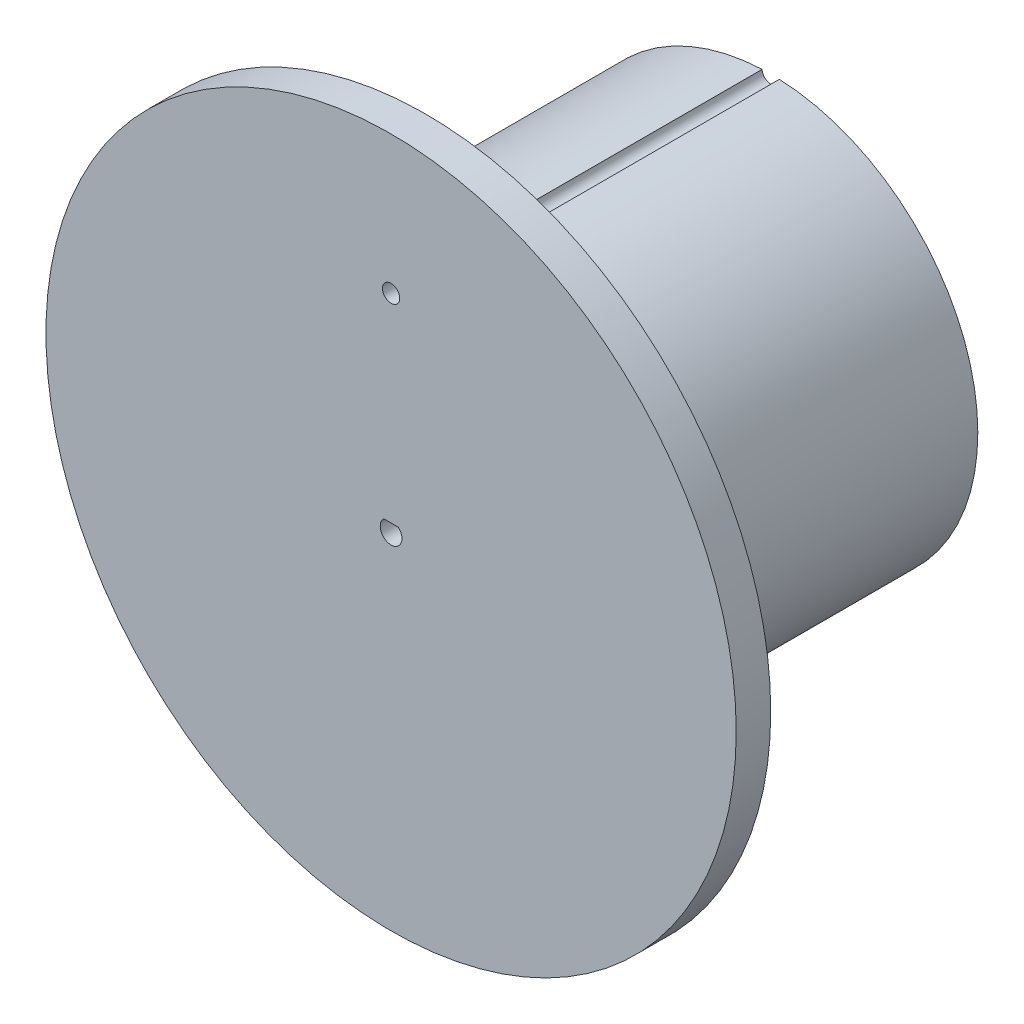
ISO-10303-21;
HEADER;
FILE_DESCRIPTION(('STEP AP214'),'2;1');
FILE_NAME('part.step','',(''),(''),'','','');
FILE_SCHEMA(('AUTOMOTIVE_DESIGN { 1 0 10303 214 1 1 1 1 }'));
ENDSEC;
DATA;
#1=APPLICATION_CONTEXT('core data for automotive mechanical design processes');
#2=APPLICATION_PROTOCOL_DEFINITION('international standard','automotive_design',2000,#1);
#3=PRODUCT_CONTEXT('',#1,'mechanical');
#4=PRODUCT('Part','Part','',(#3));
#5=PRODUCT_RELATED_PRODUCT_CATEGORY('part','',(#4));
#6=PRODUCT_DEFINITION_FORMATION('','',#4);
#7=PRODUCT_DEFINITION_CONTEXT('part definition',#1,'design');
#8=PRODUCT_DEFINITION('design','',#6,#7);
#9=PRODUCT_DEFINITION_SHAPE('','',#8);
#10=(LENGTH_UNIT() NAMED_UNIT(*) SI_UNIT(.MILLI.,.METRE.));
#11=(NAMED_UNIT(*) PLANE_ANGLE_UNIT() SI_UNIT($,.RADIAN.));
#12=(NAMED_UNIT(*) SI_UNIT($,.STERADIAN.) SOLID_ANGLE_UNIT());
#13=UNCERTAINTY_MEASURE_WITH_UNIT(LENGTH_MEASURE(1.E-05),#10,'distance_accuracy_value','');
#14=(GEOMETRIC_REPRESENTATION_CONTEXT(3) GLOBAL_UNCERTAINTY_ASSIGNED_CONTEXT((#13)) GLOBAL_UNIT_ASSIGNED_CONTEXT((#10,
#11,#12)) REPRESENTATION_CONTEXT('',''));
#15=CARTESIAN_POINT('',(0.,0.,0.));
#16=DIRECTION('',(0.,0.,1.));
#17=DIRECTION('',(1.,0.,0.));
#18=AXIS2_PLACEMENT_3D('',#15,#16,#17);
#19=CARTESIAN_POINT('',(0.,0.,31.75));
#20=DIRECTION('',(0.,0.,-1.));
#21=DIRECTION('',(-1.,0.,0.));
#22=AXIS2_PLACEMENT_3D('',#19,#20,#21);
#23=CYLINDRICAL_SURFACE('',#22,38.1);
#24=CARTESIAN_POINT('',(0.,0.,-31.75));
#25=DIRECTION('',(0.,0.,1.));
#26=DIRECTION('',(1.,0.,0.));
#27=AXIS2_PLACEMENT_3D('',#24,#25,#26);
#28=CIRCLE('',#27,38.1);
#29=CARTESIAN_POINT('',(-1.5871554530616,38.0669270833333,-31.75));
#30=VERTEX_POINT('',#29);
#31=CARTESIAN_POINT('',(1.5871554530616,38.0669270833333,-31.75));
#32=VERTEX_POINT('',#31);
#33=EDGE_CURVE('E129',#30,#32,#28,.T.);
#34=ORIENTED_EDGE('',*,*,#33,.T.);
#35=DIRECTION('',(0.,0.,-1.));
#36=VECTOR('',#35,1.);
#37=CARTESIAN_POINT('',(1.5871554530616,38.0669270833333,3.175));
#38=LINE('',#37,#36);
#39=CARTESIAN_POINT('',(1.58715545306148,38.0669270833333,31.75));
#40=VERTEX_POINT('',#39);
#41=EDGE_CURVE('E120',#32,#40,#38,.F.);
#42=ORIENTED_EDGE('',*,*,#41,.T.);
#43=CARTESIAN_POINT('',(0.,0.,31.75));
#44=DIRECTION('',(0.,0.,1.));
#45=DIRECTION('',(1.,0.,0.));
#46=AXIS2_PLACEMENT_3D('',#43,#44,#45);
#47=CIRCLE('',#46,38.1);
#48=CARTESIAN_POINT('',(-1.58715545306148,38.0669270833333,31.75));
#49=VERTEX_POINT('',#48);
#50=EDGE_CURVE('E133',#49,#40,#47,.T.);
#51=ORIENTED_EDGE('',*,*,#50,.F.);
#52=DIRECTION('',(0.,0.,-1.));
#53=VECTOR('',#52,1.);
#54=CARTESIAN_POINT('',(-1.5871554530616,38.0669270833333,3.175));
#55=LINE('',#54,#53);
#56=EDGE_CURVE('E116',#49,#30,#55,.T.);
#57=ORIENTED_EDGE('',*,*,#56,.T.);
#58=EDGE_LOOP('',(#34,#42,#51,#57));
#59=FACE_BOUND('',#58,.T.);
#60=ADVANCED_FACE('F40',(#59),#23,.T.);
#61=CARTESIAN_POINT('',(0.,0.,-31.75));
#62=DIRECTION('',(0.,0.,1.));
#63=DIRECTION('',(1.,0.,0.));
#64=AXIS2_PLACEMENT_3D('',#61,#62,#63);
#65=PLANE('',#64);
#66=CARTESIAN_POINT('',(0.,-19.05,-31.75));
#67=DIRECTION('',(0.,0.,1.));
#68=DIRECTION('',(1.,0.,0.));
#69=AXIS2_PLACEMENT_3D('',#66,#67,#68);
#70=CIRCLE('',#69,7.93750000000005);
#71=CARTESIAN_POINT('',(7.93750000000005,-19.05,-31.75));
#72=VERTEX_POINT('',#71);
#73=EDGE_CURVE('E50',#72,#72,#70,.T.);
#74=ORIENTED_EDGE('',*,*,#73,.T.);
#75=EDGE_LOOP('',(#74));
#76=FACE_BOUND('',#75,.T.);
#77=CARTESIAN_POINT('',(0.,19.05,-31.75));
#78=DIRECTION('',(0.,0.,1.));
#79=DIRECTION('',(1.,0.,0.));
#80=AXIS2_PLACEMENT_3D('',#77,#78,#79);
#81=CIRCLE('',#80,7.93750000000013);
#82=CARTESIAN_POINT('',(7.93750000000013,19.05,-31.75));
#83=VERTEX_POINT('',#82);
#84=EDGE_CURVE('E148',#83,#83,#81,.T.);
#85=ORIENTED_EDGE('',*,*,#84,.T.);
#86=EDGE_LOOP('',(#85));
#87=FACE_BOUND('',#86,.T.);
#88=DIRECTION('',(1.,0.,0.));
#89=VECTOR('',#88,1.);
#90=CARTESIAN_POINT('',(1.3228756555323,1.5,-31.75));
#91=LINE('',#90,#89);
#92=CARTESIAN_POINT('',(-1.3228756555323,1.5,-31.75));
#93=VERTEX_POINT('',#92);
#94=CARTESIAN_POINT('',(1.3228756555323,1.5,-31.75));
#95=VERTEX_POINT('',#94);
#96=EDGE_CURVE('E97',#93,#95,#91,.T.);
#97=ORIENTED_EDGE('',*,*,#96,.F.);
#98=CARTESIAN_POINT('',(0.,0.,-31.75));
#99=DIRECTION('',(0.,0.,-1.));
#100=DIRECTION('',(-1.,0.,0.));
#101=AXIS2_PLACEMENT_3D('',#98,#99,#100);
#102=CIRCLE('',#101,2.);
#103=EDGE_CURVE('E57',#95,#93,#102,.T.);
#104=ORIENTED_EDGE('',*,*,#103,.F.);
#105=EDGE_LOOP('',(#97,#104));
#106=FACE_BOUND('',#105,.T.);
#107=ORIENTED_EDGE('',*,*,#33,.F.);
#108=CARTESIAN_POINT('',(0.,38.1,-31.75));
#109=DIRECTION('',(0.,0.,-1.));
#110=DIRECTION('',(-1.,0.,0.));
#111=AXIS2_PLACEMENT_3D('',#108,#109,#110);
#112=CIRCLE('',#111,1.5875);
#113=EDGE_CURVE('E108',#32,#30,#112,.T.);
#114=ORIENTED_EDGE('',*,*,#113,.F.);
#115=EDGE_LOOP('',(#107,#114));
#116=FACE_BOUND('',#115,.T.);
#117=ADVANCED_FACE('F155',(#76,#87,#106,#116),#65,.F.);
#118=CARTESIAN_POINT('',(0.,0.,38.1));
#119=DIRECTION('',(0.,0.,-1.));
#120=DIRECTION('',(-1.,0.,0.));
#121=AXIS2_PLACEMENT_3D('',#118,#119,#120);
#122=CYLINDRICAL_SURFACE('',#121,63.5);
#123=CARTESIAN_POINT('',(0.,0.,38.1));
#124=DIRECTION('',(0.,0.,1.));
#125=DIRECTION('',(1.,0.,0.));
#126=AXIS2_PLACEMENT_3D('',#123,#124,#125);
#127=CIRCLE('',#126,63.5);
#128=CARTESIAN_POINT('',(63.5,0.,38.1));
#129=VERTEX_POINT('',#128);
#130=EDGE_CURVE('E125',#129,#129,#127,.T.);
#131=ORIENTED_EDGE('',*,*,#130,.F.);
#132=EDGE_LOOP('',(#131));
#133=FACE_BOUND('',#132,.T.);
#134=CARTESIAN_POINT('',(0.,0.,31.75));
#135=DIRECTION('',(0.,0.,1.));
#136=DIRECTION('',(1.,0.,0.));
#137=AXIS2_PLACEMENT_3D('',#134,#135,#136);
#138=CIRCLE('',#137,63.5);
#139=CARTESIAN_POINT('',(63.5,0.,31.75));
#140=VERTEX_POINT('',#139);
#141=EDGE_CURVE('E124',#140,#140,#138,.T.);
#142=ORIENTED_EDGE('',*,*,#141,.T.);
#143=EDGE_LOOP('',(#142));
#144=FACE_BOUND('',#143,.T.);
#145=ADVANCED_FACE('F175',(#133,#144),#122,.T.);
#146=CARTESIAN_POINT('',(0.,0.,38.1));
#147=DIRECTION('',(0.,0.,1.));
#148=DIRECTION('',(1.,0.,0.));
#149=AXIS2_PLACEMENT_3D('',#146,#147,#148);
#150=PLANE('',#149);
#151=CARTESIAN_POINT('',(0.,0.,38.1));
#152=DIRECTION('',(0.,0.,-1.));
#153=DIRECTION('',(-1.,0.,0.));
#154=AXIS2_PLACEMENT_3D('',#151,#152,#153);
#155=CIRCLE('',#154,2.);
#156=CARTESIAN_POINT('',(1.3228756555323,1.5,38.1));
#157=VERTEX_POINT('',#156);
#158=CARTESIAN_POINT('',(-1.3228756555323,1.5,38.1));
#159=VERTEX_POINT('',#158);
#160=EDGE_CURVE('E62',#157,#159,#155,.T.);
#161=ORIENTED_EDGE('',*,*,#160,.T.);
#162=DIRECTION('',(1.,0.,0.));
#163=VECTOR('',#162,1.);
#164=CARTESIAN_POINT('',(1.3228756555323,1.5,38.1));
#165=LINE('',#164,#163);
#166=EDGE_CURVE('E87',#159,#157,#165,.T.);
#167=ORIENTED_EDGE('',*,*,#166,.T.);
#168=EDGE_LOOP('',(#161,#167));
#169=FACE_BOUND('',#168,.T.);
#170=CARTESIAN_POINT('',(0.,38.1,38.1));
#171=DIRECTION('',(0.,0.,-1.));
#172=DIRECTION('',(-1.,0.,0.));
#173=AXIS2_PLACEMENT_3D('',#170,#171,#172);
#174=CIRCLE('',#173,1.5875);
#175=CARTESIAN_POINT('',(-1.5875,38.1,38.1));
#176=VERTEX_POINT('',#175);
#177=EDGE_CURVE('E112',#176,#176,#174,.T.);
#178=ORIENTED_EDGE('',*,*,#177,.T.);
#179=EDGE_LOOP('',(#178));
#180=FACE_BOUND('',#179,.T.);
#181=ORIENTED_EDGE('',*,*,#130,.T.);
#182=EDGE_LOOP('',(#181));
#183=FACE_BOUND('',#182,.T.);
#184=ADVANCED_FACE('F94',(#169,#180,#183),#150,.T.);
#185=CARTESIAN_POINT('',(0.,0.,31.75));
#186=DIRECTION('',(0.,0.,1.));
#187=DIRECTION('',(1.,0.,0.));
#188=AXIS2_PLACEMENT_3D('',#185,#186,#187);
#189=PLANE('',#188);
#190=ORIENTED_EDGE('',*,*,#50,.T.);
#191=CARTESIAN_POINT('',(0.,38.1,31.75));
#192=DIRECTION('',(0.,0.,1.));
#193=DIRECTION('',(1.,0.,0.));
#194=AXIS2_PLACEMENT_3D('',#191,#192,#193);
#195=CIRCLE('',#194,1.5875);
#196=EDGE_CURVE('E137',#40,#49,#195,.T.);
#197=ORIENTED_EDGE('',*,*,#196,.T.);
#198=EDGE_LOOP('',(#190,#197));
#199=FACE_BOUND('',#198,.T.);
#200=ORIENTED_EDGE('',*,*,#141,.F.);
#201=EDGE_LOOP('',(#200));
#202=FACE_BOUND('',#201,.T.);
#203=ADVANCED_FACE('F219',(#199,#202),#189,.F.);
#204=CARTESIAN_POINT('',(0.,38.1,38.1));
#205=DIRECTION('',(0.,0.,-1.));
#206=DIRECTION('',(-1.,0.,0.));
#207=AXIS2_PLACEMENT_3D('',#204,#205,#206);
#208=CYLINDRICAL_SURFACE('',#207,1.5875);
#209=ORIENTED_EDGE('',*,*,#177,.F.);
#210=EDGE_LOOP('',(#209));
#211=FACE_BOUND('',#210,.T.);
#212=ORIENTED_EDGE('',*,*,#113,.T.);
#213=ORIENTED_EDGE('',*,*,#56,.F.);
#214=ORIENTED_EDGE('',*,*,#196,.F.);
#215=ORIENTED_EDGE('',*,*,#41,.F.);
#216=EDGE_LOOP('',(#212,#213,#214,#215));
#217=FACE_BOUND('',#216,.T.);
#218=ADVANCED_FACE('F216',(#211,#217),#208,.F.);
#219=CARTESIAN_POINT('',(0.,0.,38.1));
#220=DIRECTION('',(0.,0.,-1.));
#221=DIRECTION('',(-1.,0.,0.));
#222=AXIS2_PLACEMENT_3D('',#219,#220,#221);
#223=CYLINDRICAL_SURFACE('',#222,2.);
#224=ORIENTED_EDGE('',*,*,#103,.T.);
#225=DIRECTION('',(0.,0.,-1.));
#226=VECTOR('',#225,1.);
#227=CARTESIAN_POINT('',(-1.3228756555323,1.5,38.1));
#228=LINE('',#227,#226);
#229=EDGE_CURVE('E79',#159,#93,#228,.T.);
#230=ORIENTED_EDGE('',*,*,#229,.F.);
#231=ORIENTED_EDGE('',*,*,#160,.F.);
#232=DIRECTION('',(0.,0.,-1.));
#233=VECTOR('',#232,1.);
#234=CARTESIAN_POINT('',(1.3228756555323,1.5,38.1));
#235=LINE('',#234,#233);
#236=EDGE_CURVE('E86',#157,#95,#235,.T.);
#237=ORIENTED_EDGE('',*,*,#236,.T.);
#238=EDGE_LOOP('',(#224,#230,#231,#237));
#239=FACE_BOUND('',#238,.T.);
#240=ADVANCED_FACE('F81',(#239),#223,.F.);
#241=CARTESIAN_POINT('',(1.3228756555323,1.5,38.1));
#242=DIRECTION('',(0.,1.,0.));
#243=DIRECTION('',(0.,0.,1.));
#244=AXIS2_PLACEMENT_3D('',#241,#242,#243);
#245=PLANE('',#244);
#246=ORIENTED_EDGE('',*,*,#96,.T.);
#247=ORIENTED_EDGE('',*,*,#236,.F.);
#248=ORIENTED_EDGE('',*,*,#166,.F.);
#249=ORIENTED_EDGE('',*,*,#229,.T.);
#250=EDGE_LOOP('',(#246,#247,#248,#249));
#251=FACE_BOUND('',#250,.T.);
#252=ADVANCED_FACE('F90',(#251),#245,.F.);
#253=CARTESIAN_POINT('',(0.,19.05,-12.7));
#254=DIRECTION('',(0.,0.,-1.));
#255=DIRECTION('',(-1.,0.,0.));
#256=AXIS2_PLACEMENT_3D('',#253,#254,#255);
#257=CYLINDRICAL_SURFACE('',#256,4.7625);
#258=CARTESIAN_POINT('',(0.,19.05,-28.5749999999999));
#259=DIRECTION('',(0.,0.,1.));
#260=DIRECTION('',(1.,0.,0.));
#261=AXIS2_PLACEMENT_3D('',#258,#259,#260);
#262=CIRCLE('',#261,4.7625);
#263=CARTESIAN_POINT('',(-4.7625,19.05,-28.5749999999999));
#264=VERTEX_POINT('',#263);
#265=EDGE_CURVE('E144',#264,#264,#262,.F.);
#266=CARTESIAN_POINT('',(0.,19.05,-12.7));
#267=DIRECTION('',(0.,0.,-1.));
#268=DIRECTION('',(-1.,0.,0.));
#269=AXIS2_PLACEMENT_3D('',#266,#267,#268);
#270=CIRCLE('',#269,4.7625);
#271=CARTESIAN_POINT('',(-4.7625,19.05,-12.7));
#272=VERTEX_POINT('',#271);
#273=EDGE_CURVE('E102',#272,#272,#270,.T.);
#274=CARTESIAN_POINT('',(-4.7625,19.05,-28.5749999999999));
#275=CARTESIAN_POINT('',(-4.7625,19.05,-28.4096354166666));
#276=CARTESIAN_POINT('',(-4.7625,19.05,-28.2442708333332));
#277=CARTESIAN_POINT('',(-4.7625,19.05,-27.9135416666666));
#278=CARTESIAN_POINT('',(-4.7625,19.05,-27.7481770833332));
#279=CARTESIAN_POINT('',(-4.7625,19.05,-27.4174479166666));
#280=CARTESIAN_POINT('',(-4.7625,19.05,-27.2520833333332));
#281=CARTESIAN_POINT('',(-4.7625,19.05,-26.9213541666666));
#282=CARTESIAN_POINT('',(-4.7625,19.05,-26.7559895833332));
#283=CARTESIAN_POINT('',(-4.7625,19.05,-26.4252604166666));
#284=CARTESIAN_POINT('',(-4.7625,19.05,-26.2598958333332));
#285=CARTESIAN_POINT('',(-4.7625,19.05,-25.9291666666666));
#286=CARTESIAN_POINT('',(-4.7625,19.05,-25.7638020833333));
#287=CARTESIAN_POINT('',(-4.7625,19.05,-25.4330729166666));
#288=CARTESIAN_POINT('',(-4.7625,19.05,-25.2677083333333));
#289=CARTESIAN_POINT('',(-4.7625,19.05,-24.9369791666666));
#290=CARTESIAN_POINT('',(-4.7625,19.05,-24.7716145833333));
#291=CARTESIAN_POINT('',(-4.7625,19.05,-24.4408854166666));
#292=CARTESIAN_POINT('',(-4.7625,19.05,-24.2755208333333));
#293=CARTESIAN_POINT('',(-4.7625,19.05,-23.9447916666666));
#294=CARTESIAN_POINT('',(-4.7625,19.05,-23.7794270833333));
#295=CARTESIAN_POINT('',(-4.7625,19.05,-23.4486979166666));
#296=CARTESIAN_POINT('',(-4.7625,19.05,-23.2833333333333));
#297=CARTESIAN_POINT('',(-4.7625,19.05,-22.9526041666666));
#298=CARTESIAN_POINT('',(-4.7625,19.05,-22.7872395833333));
#299=CARTESIAN_POINT('',(-4.7625,19.05,-22.4565104166666));
#300=CARTESIAN_POINT('',(-4.7625,19.05,-22.2911458333333));
#301=CARTESIAN_POINT('',(-4.7625,19.05,-21.9604166666666));
#302=CARTESIAN_POINT('',(-4.7625,19.05,-21.7950520833333));
#303=CARTESIAN_POINT('',(-4.7625,19.05,-21.4643229166666));
#304=CARTESIAN_POINT('',(-4.7625,19.05,-21.2989583333333));
#305=CARTESIAN_POINT('',(-4.7625,19.05,-20.9682291666666));
#306=CARTESIAN_POINT('',(-4.7625,19.05,-20.8028645833333));
#307=CARTESIAN_POINT('',(-4.7625,19.05,-20.4721354166666));
#308=CARTESIAN_POINT('',(-4.7625,19.05,-20.3067708333333));
#309=CARTESIAN_POINT('',(-4.7625,19.05,-19.9760416666666));
#310=CARTESIAN_POINT('',(-4.7625,19.05,-19.8106770833333));
#311=CARTESIAN_POINT('',(-4.7625,19.05,-19.4799479166666));
#312=CARTESIAN_POINT('',(-4.7625,19.05,-19.3145833333333));
#313=CARTESIAN_POINT('',(-4.7625,19.05,-18.9838541666666));
#314=CARTESIAN_POINT('',(-4.7625,19.05,-18.8184895833333));
#315=CARTESIAN_POINT('',(-4.7625,19.05,-18.4877604166666));
#316=CARTESIAN_POINT('',(-4.7625,19.05,-18.3223958333333));
#317=CARTESIAN_POINT('',(-4.7625,19.05,-17.9916666666666));
#318=CARTESIAN_POINT('',(-4.7625,19.05,-17.8263020833333));
#319=CARTESIAN_POINT('',(-4.7625,19.05,-17.4955729166666));
#320=CARTESIAN_POINT('',(-4.7625,19.05,-17.3302083333333));
#321=CARTESIAN_POINT('',(-4.7625,19.05,-16.9994791666666));
#322=CARTESIAN_POINT('',(-4.7625,19.05,-16.8341145833333));
#323=CARTESIAN_POINT('',(-4.7625,19.05,-16.5033854166666));
#324=CARTESIAN_POINT('',(-4.7625,19.05,-16.3380208333333));
#325=CARTESIAN_POINT('',(-4.7625,19.05,-16.0072916666666));
#326=CARTESIAN_POINT('',(-4.7625,19.05,-15.8419270833333));
#327=CARTESIAN_POINT('',(-4.7625,19.05,-15.5111979166666));
#328=CARTESIAN_POINT('',(-4.7625,19.05,-15.3458333333333));
#329=CARTESIAN_POINT('',(-4.7625,19.05,-15.0151041666667));
#330=CARTESIAN_POINT('',(-4.7625,19.05,-14.8497395833333));
#331=CARTESIAN_POINT('',(-4.7625,19.05,-14.5190104166667));
#332=CARTESIAN_POINT('',(-4.7625,19.05,-14.3536458333333));
#333=CARTESIAN_POINT('',(-4.7625,19.05,-14.0229166666667));
#334=CARTESIAN_POINT('',(-4.7625,19.05,-13.8575520833333));
#335=CARTESIAN_POINT('',(-4.7625,19.05,-13.5268229166667));
#336=CARTESIAN_POINT('',(-4.7625,19.05,-13.3614583333333));
#337=CARTESIAN_POINT('',(-4.7625,19.05,-13.0307291666667));
#338=CARTESIAN_POINT('',(-4.7625,19.05,-12.8653645833333));
#339=CARTESIAN_POINT('',(-4.7625,19.05,-12.7));
#340=B_SPLINE_CURVE_WITH_KNOTS('',3,(#274,#275,#276,#277,#278,#279,#280,#281,#282,#283,#284,
#285,#286,#287,#288,#289,#290,#291,#292,#293,#294,#295,#296,#297,#298,#299,#300,#301,#302,#303,
#304,#305,#306,#307,#308,#309,#310,#311,#312,#313,#314,#315,#316,#317,#318,#319,#320,#321,#322,
#323,#324,#325,#326,#327,#328,#329,#330,#331,#332,#333,#334,#335,#336,#337,#338,#339),
.UNSPECIFIED.,.F.,.F.,(4,2,2,2,2,2,2,2,2,2,2,2,2,2,2,2,2,2,2,2,2,2,2,2,2,2,2,2,2,2,2,2,4),(0.,
0.496093749999996,0.992187499999991,1.48828124999999,1.98437499999999,2.48046874999999,
2.97656249999998,3.47265624999998,3.96874999999998,4.46484374999998,4.96093749999997,
5.45703124999997,5.95312499999996,6.44921874999996,6.94531249999996,7.44140624999996,
7.93749999999995,8.43359374999995,8.92968749999995,9.42578124999994,9.92187499999994,
10.4179687499999,10.9140624999999,11.4101562499999,11.9062499999999,12.4023437499999,
12.8984374999999,13.3945312499999,13.8906249999999,14.3867187499999,14.8828124999999,
15.3789062499999,15.8749999999999),.UNSPECIFIED.);
#341=EDGE_CURVE('BSEAM191',#264,#272,#340,.T.);
#342=ORIENTED_EDGE('',*,*,#265,.T.);
#343=ORIENTED_EDGE('',*,*,#273,.F.);
#344=ORIENTED_EDGE('',*,*,#341,.T.);
#345=ORIENTED_EDGE('',*,*,#341,.F.);
#346=EDGE_LOOP('',(#342,#344,#343,#345));
#347=FACE_BOUND('',#346,.T.);
#348=ADVANCED_FACE('F191',(#347),#257,.F.);
#349=CARTESIAN_POINT('',(0.,19.05,-12.7));
#350=DIRECTION('',(0.,0.,-1.));
#351=DIRECTION('',(-1.,0.,0.));
#352=AXIS2_PLACEMENT_3D('',#349,#350,#351);
#353=PLANE('',#352);
#354=ORIENTED_EDGE('',*,*,#273,.T.);
#355=EDGE_LOOP('',(#354));
#356=FACE_BOUND('',#355,.T.);
#357=ADVANCED_FACE('F183',(#356),#353,.T.);
#358=CARTESIAN_POINT('',(0.,19.05,-28.5749999999999));
#359=DIRECTION('',(0.,0.,-1.));
#360=DIRECTION('',(-1.,0.,0.));
#361=AXIS2_PLACEMENT_3D('',#358,#359,#360);
#362=CONICAL_SURFACE('',#361,4.7625,0.785398163397453);
#363=ORIENTED_EDGE('',*,*,#84,.F.);
#364=EDGE_LOOP('',(#363));
#365=FACE_BOUND('',#364,.T.);
#366=ORIENTED_EDGE('',*,*,#265,.F.);
#367=EDGE_LOOP('',(#366));
#368=FACE_BOUND('',#367,.T.);
#369=ADVANCED_FACE('F179',(#365,#368),#362,.F.);
#370=CARTESIAN_POINT('',(0.,-19.05,-12.7));
#371=DIRECTION('',(0.,0.,-1.));
#372=DIRECTION('',(-1.,0.,0.));
#373=AXIS2_PLACEMENT_3D('',#370,#371,#372);
#374=CYLINDRICAL_SURFACE('',#373,4.7625);
#375=CARTESIAN_POINT('',(0.,-19.05,-28.575));
#376=DIRECTION('',(0.,0.,1.));
#377=DIRECTION('',(1.,0.,0.));
#378=AXIS2_PLACEMENT_3D('',#375,#376,#377);
#379=CIRCLE('',#378,4.7625);
#380=CARTESIAN_POINT('',(-4.7625,-19.05,-28.575));
#381=VERTEX_POINT('',#380);
#382=EDGE_CURVE('E11',#381,#381,#379,.F.);
#383=CARTESIAN_POINT('',(0.,-19.05,-12.7));
#384=DIRECTION('',(0.,0.,1.));
#385=DIRECTION('',(-1.,0.,0.));
#386=AXIS2_PLACEMENT_3D('',#383,#384,#385);
#387=CIRCLE('',#386,4.7625);
#388=CARTESIAN_POINT('',(-4.7625,-19.05,-12.7));
#389=VERTEX_POINT('',#388);
#390=EDGE_CURVE('E204',#389,#389,#387,.T.);
#391=CARTESIAN_POINT('',(-4.7625,-19.05,-28.575));
#392=CARTESIAN_POINT('',(-4.7625,-19.05,-28.4096354166667));
#393=CARTESIAN_POINT('',(-4.7625,-19.05,-28.2442708333333));
#394=CARTESIAN_POINT('',(-4.7625,-19.05,-27.9135416666667));
#395=CARTESIAN_POINT('',(-4.7625,-19.05,-27.7481770833333));
#396=CARTESIAN_POINT('',(-4.7625,-19.05,-27.4174479166666));
#397=CARTESIAN_POINT('',(-4.7625,-19.05,-27.2520833333333));
#398=CARTESIAN_POINT('',(-4.7625,-19.05,-26.9213541666666));
#399=CARTESIAN_POINT('',(-4.7625,-19.05,-26.7559895833333));
#400=CARTESIAN_POINT('',(-4.7625,-19.05,-26.4252604166667));
#401=CARTESIAN_POINT('',(-4.7625,-19.05,-26.2598958333333));
#402=CARTESIAN_POINT('',(-4.7625,-19.05,-25.9291666666667));
#403=CARTESIAN_POINT('',(-4.7625,-19.05,-25.7638020833333));
#404=CARTESIAN_POINT('',(-4.7625,-19.05,-25.4330729166667));
#405=CARTESIAN_POINT('',(-4.7625,-19.05,-25.2677083333333));
#406=CARTESIAN_POINT('',(-4.7625,-19.05,-24.9369791666667));
#407=CARTESIAN_POINT('',(-4.7625,-19.05,-24.7716145833333));
#408=CARTESIAN_POINT('',(-4.7625,-19.05,-24.4408854166667));
#409=CARTESIAN_POINT('',(-4.7625,-19.05,-24.2755208333333));
#410=CARTESIAN_POINT('',(-4.7625,-19.05,-23.9447916666667));
#411=CARTESIAN_POINT('',(-4.7625,-19.05,-23.7794270833333));
#412=CARTESIAN_POINT('',(-4.7625,-19.05,-23.4486979166667));
#413=CARTESIAN_POINT('',(-4.7625,-19.05,-23.2833333333333));
#414=CARTESIAN_POINT('',(-4.7625,-19.05,-22.9526041666667));
#415=CARTESIAN_POINT('',(-4.7625,-19.05,-22.7872395833333));
#416=CARTESIAN_POINT('',(-4.7625,-19.05,-22.4565104166667));
#417=CARTESIAN_POINT('',(-4.7625,-19.05,-22.2911458333333));
#418=CARTESIAN_POINT('',(-4.7625,-19.05,-21.9604166666667));
#419=CARTESIAN_POINT('',(-4.7625,-19.05,-21.7950520833333));
#420=CARTESIAN_POINT('',(-4.7625,-19.05,-21.4643229166667));
#421=CARTESIAN_POINT('',(-4.7625,-19.05,-21.2989583333333));
#422=CARTESIAN_POINT('',(-4.7625,-19.05,-20.9682291666667));
#423=CARTESIAN_POINT('',(-4.7625,-19.05,-20.8028645833333));
#424=CARTESIAN_POINT('',(-4.7625,-19.05,-20.4721354166667));
#425=CARTESIAN_POINT('',(-4.7625,-19.05,-20.3067708333333));
#426=CARTESIAN_POINT('',(-4.7625,-19.05,-19.9760416666667));
#427=CARTESIAN_POINT('',(-4.7625,-19.05,-19.8106770833333));
#428=CARTESIAN_POINT('',(-4.7625,-19.05,-19.4799479166667));
#429=CARTESIAN_POINT('',(-4.7625,-19.05,-19.3145833333333));
#430=CARTESIAN_POINT('',(-4.7625,-19.05,-18.9838541666667));
#431=CARTESIAN_POINT('',(-4.7625,-19.05,-18.8184895833333));
#432=CARTESIAN_POINT('',(-4.7625,-19.05,-18.4877604166667));
#433=CARTESIAN_POINT('',(-4.7625,-19.05,-18.3223958333333));
#434=CARTESIAN_POINT('',(-4.7625,-19.05,-17.9916666666667));
#435=CARTESIAN_POINT('',(-4.7625,-19.05,-17.8263020833333));
#436=CARTESIAN_POINT('',(-4.7625,-19.05,-17.4955729166667));
#437=CARTESIAN_POINT('',(-4.7625,-19.05,-17.3302083333333));
#438=CARTESIAN_POINT('',(-4.7625,-19.05,-16.9994791666667));
#439=CARTESIAN_POINT('',(-4.7625,-19.05,-16.8341145833333));
#440=CARTESIAN_POINT('',(-4.7625,-19.05,-16.5033854166667));
#441=CARTESIAN_POINT('',(-4.7625,-19.05,-16.3380208333333));
#442=CARTESIAN_POINT('',(-4.7625,-19.05,-16.0072916666667));
#443=CARTESIAN_POINT('',(-4.7625,-19.05,-15.8419270833333));
#444=CARTESIAN_POINT('',(-4.7625,-19.05,-15.5111979166667));
#445=CARTESIAN_POINT('',(-4.7625,-19.05,-15.3458333333333));
#446=CARTESIAN_POINT('',(-4.7625,-19.05,-15.0151041666667));
#447=CARTESIAN_POINT('',(-4.7625,-19.05,-14.8497395833333));
#448=CARTESIAN_POINT('',(-4.7625,-19.05,-14.5190104166667));
#449=CARTESIAN_POINT('',(-4.7625,-19.05,-14.3536458333333));
#450=CARTESIAN_POINT('',(-4.7625,-19.05,-14.0229166666667));
#451=CARTESIAN_POINT('',(-4.7625,-19.05,-13.8575520833333));
#452=CARTESIAN_POINT('',(-4.7625,-19.05,-13.5268229166667));
#453=CARTESIAN_POINT('',(-4.7625,-19.05,-13.3614583333333));
#454=CARTESIAN_POINT('',(-4.7625,-19.05,-13.0307291666667));
#455=CARTESIAN_POINT('',(-4.7625,-19.05,-12.8653645833333));
#456=CARTESIAN_POINT('',(-4.7625,-19.05,-12.7));
#457=B_SPLINE_CURVE_WITH_KNOTS('',3,(#391,#392,#393,#394,#395,#396,#397,#398,#399,#400,#401,
#402,#403,#404,#405,#406,#407,#408,#409,#410,#411,#412,#413,#414,#415,#416,#417,#418,#419,#420,
#421,#422,#423,#424,#425,#426,#427,#428,#429,#430,#431,#432,#433,#434,#435,#436,#437,#438,#439,
#440,#441,#442,#443,#444,#445,#446,#447,#448,#449,#450,#451,#452,#453,#454,#455,#456),
.UNSPECIFIED.,.F.,.F.,(4,2,2,2,2,2,2,2,2,2,2,2,2,2,2,2,2,2,2,2,2,2,2,2,2,2,2,2,2,2,2,2,4),(0.,
0.496093749999996,0.992187499999998,1.48828125,1.984375,2.48046875,2.97656249999999,3.47265625,
3.96874999999999,4.46484375,4.96093749999999,5.45703124999999,5.95312499999999,6.44921874999999,
6.94531249999999,7.44140624999999,7.93749999999999,8.43359374999999,8.92968749999999,
9.42578124999999,9.92187499999999,10.41796875,10.9140625,11.41015625,11.90625,12.40234375,
12.8984375,13.39453125,13.890625,14.38671875,14.8828125,15.37890625,15.875),.UNSPECIFIED.);
#458=EDGE_CURVE('BSEAM164',#381,#389,#457,.T.);
#459=ORIENTED_EDGE('',*,*,#382,.T.);
#460=ORIENTED_EDGE('',*,*,#390,.T.);
#461=ORIENTED_EDGE('',*,*,#458,.T.);
#462=ORIENTED_EDGE('',*,*,#458,.F.);
#463=EDGE_LOOP('',(#459,#461,#460,#462));
#464=FACE_BOUND('',#463,.T.);
#465=ADVANCED_FACE('F164',(#464),#374,.F.);
#466=CARTESIAN_POINT('',(0.,-19.05,-12.7));
#467=DIRECTION('',(0.,0.,-1.));
#468=DIRECTION('',(-1.,0.,0.));
#469=AXIS2_PLACEMENT_3D('',#466,#467,#468);
#470=PLANE('',#469);
#471=ORIENTED_EDGE('',*,*,#390,.F.);
#472=EDGE_LOOP('',(#471));
#473=FACE_BOUND('',#472,.T.);
#474=ADVANCED_FACE('F159',(#473),#470,.T.);
#475=CARTESIAN_POINT('',(0.,-19.05,-31.75));
#476=DIRECTION('',(0.,0.,-1.));
#477=DIRECTION('',(-1.,0.,0.));
#478=AXIS2_PLACEMENT_3D('',#475,#476,#477);
#479=CONICAL_SURFACE('',#478,7.93750000000005,0.785398163397452);
#480=ORIENTED_EDGE('',*,*,#382,.F.);
#481=EDGE_LOOP('',(#480));
#482=FACE_BOUND('',#481,.T.);
#483=ORIENTED_EDGE('',*,*,#73,.F.);
#484=EDGE_LOOP('',(#483));
#485=FACE_BOUND('',#484,.T.);
#486=ADVANCED_FACE('F43',(#482,#485),#479,.F.);
#487=CLOSED_SHELL('',(#60,#117,#145,#184,#203,#218,#240,#252,#348,#357,#369,#465,#474,#486));
#488=MANIFOLD_SOLID_BREP('B2',#487);
#489=ADVANCED_BREP_SHAPE_REPRESENTATION('',(#18,#488),#14);
#490=SHAPE_DEFINITION_REPRESENTATION(#9,#489);
ENDSEC;
END-ISO-10303-21;
